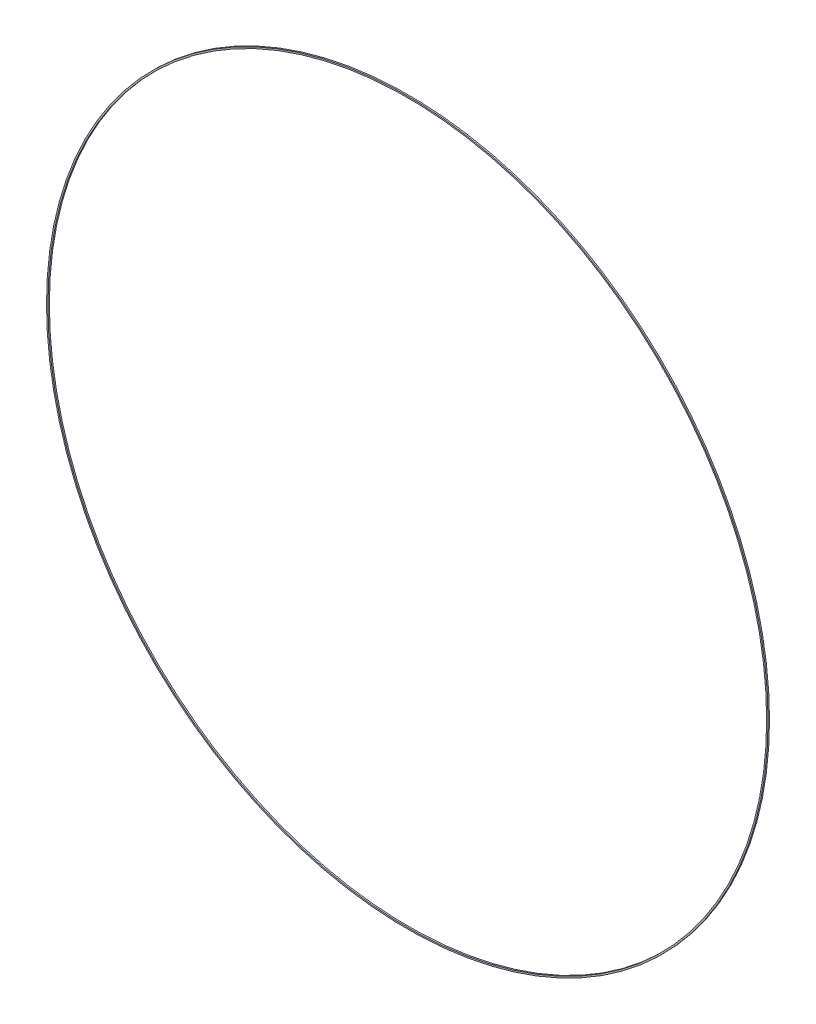
ISO-10303-21;
HEADER;
FILE_DESCRIPTION(('STEP AP214'),'2;1');
FILE_NAME('part.step','',(''),(''),'','','');
FILE_SCHEMA(('AUTOMOTIVE_DESIGN { 1 0 10303 214 1 1 1 1 }'));
ENDSEC;
DATA;
#1=APPLICATION_CONTEXT('core data for automotive mechanical design processes');
#2=APPLICATION_PROTOCOL_DEFINITION('international standard','automotive_design',2000,#1);
#3=PRODUCT_CONTEXT('',#1,'mechanical');
#4=PRODUCT('Part','Part','',(#3));
#5=PRODUCT_RELATED_PRODUCT_CATEGORY('part','',(#4));
#6=PRODUCT_DEFINITION_FORMATION('','',#4);
#7=PRODUCT_DEFINITION_CONTEXT('part definition',#1,'design');
#8=PRODUCT_DEFINITION('design','',#6,#7);
#9=PRODUCT_DEFINITION_SHAPE('','',#8);
#10=(LENGTH_UNIT() NAMED_UNIT(*) SI_UNIT(.MILLI.,.METRE.));
#11=(NAMED_UNIT(*) PLANE_ANGLE_UNIT() SI_UNIT($,.RADIAN.));
#12=(NAMED_UNIT(*) SI_UNIT($,.STERADIAN.) SOLID_ANGLE_UNIT());
#13=UNCERTAINTY_MEASURE_WITH_UNIT(LENGTH_MEASURE(1.E-05),#10,'distance_accuracy_value','');
#14=(GEOMETRIC_REPRESENTATION_CONTEXT(3) GLOBAL_UNCERTAINTY_ASSIGNED_CONTEXT((#13)) GLOBAL_UNIT_ASSIGNED_CONTEXT((#10,
#11,#12)) REPRESENTATION_CONTEXT('',''));
#15=CARTESIAN_POINT('',(0.,0.,0.));
#16=DIRECTION('',(0.,0.,1.));
#17=DIRECTION('',(1.,0.,0.));
#18=AXIS2_PLACEMENT_3D('',#15,#16,#17);
#19=CARTESIAN_POINT('',(0.,-500.5,2.));
#20=DIRECTION('',(0.,0.,1.));
#21=DIRECTION('',(1.,0.,0.));
#22=AXIS2_PLACEMENT_3D('',#19,#20,#21);
#23=PLANE('',#22);
#24=CARTESIAN_POINT('',(0.,-500.5,2.));
#25=DIRECTION('',(0.,0.,1.));
#26=DIRECTION('',(1.,0.,0.));
#27=AXIS2_PLACEMENT_3D('',#24,#25,#26);
#28=CIRCLE('',#27,500.5);
#29=CARTESIAN_POINT('',(500.5,-500.5,2.));
#30=VERTEX_POINT('',#29);
#31=EDGE_CURVE('E10',#30,#30,#28,.T.);
#32=ORIENTED_EDGE('',*,*,#31,.T.);
#33=EDGE_LOOP('',(#32));
#34=FACE_BOUND('',#33,.T.);
#35=CARTESIAN_POINT('',(0.,-500.5,2.));
#36=DIRECTION('',(0.,0.,1.));
#37=DIRECTION('',(1.,0.,0.));
#38=AXIS2_PLACEMENT_3D('',#35,#36,#37);
#39=CIRCLE('',#38,498.5);
#40=CARTESIAN_POINT('',(498.5,-500.5,2.));
#41=VERTEX_POINT('',#40);
#42=EDGE_CURVE('E42',#41,#41,#39,.T.);
#43=ORIENTED_EDGE('',*,*,#42,.F.);
#44=EDGE_LOOP('',(#43));
#45=FACE_BOUND('',#44,.T.);
#46=ADVANCED_FACE('F31',(#34,#45),#23,.T.);
#47=CARTESIAN_POINT('',(0.,-500.5,0.));
#48=DIRECTION('',(0.,0.,1.));
#49=DIRECTION('',(1.,0.,0.));
#50=AXIS2_PLACEMENT_3D('',#47,#48,#49);
#51=PLANE('',#50);
#52=CARTESIAN_POINT('',(0.,-500.5,0.));
#53=DIRECTION('',(0.,0.,1.));
#54=DIRECTION('',(1.,0.,0.));
#55=AXIS2_PLACEMENT_3D('',#52,#53,#54);
#56=CIRCLE('',#55,500.5);
#57=CARTESIAN_POINT('',(500.5,-500.5,0.));
#58=VERTEX_POINT('',#57);
#59=EDGE_CURVE('E35',#58,#58,#56,.T.);
#60=ORIENTED_EDGE('',*,*,#59,.F.);
#61=EDGE_LOOP('',(#60));
#62=FACE_BOUND('',#61,.T.);
#63=CARTESIAN_POINT('',(0.,-500.5,0.));
#64=DIRECTION('',(0.,0.,1.));
#65=DIRECTION('',(1.,0.,0.));
#66=AXIS2_PLACEMENT_3D('',#63,#64,#65);
#67=CIRCLE('',#66,498.5);
#68=CARTESIAN_POINT('',(498.5,-500.5,0.));
#69=VERTEX_POINT('',#68);
#70=EDGE_CURVE('E44',#69,#69,#67,.T.);
#71=ORIENTED_EDGE('',*,*,#70,.T.);
#72=EDGE_LOOP('',(#71));
#73=FACE_BOUND('',#72,.T.);
#74=ADVANCED_FACE('F54',(#62,#73),#51,.F.);
#75=CARTESIAN_POINT('',(0.,-500.5,2.));
#76=DIRECTION('',(0.,0.,-1.));
#77=DIRECTION('',(-1.,0.,0.));
#78=AXIS2_PLACEMENT_3D('',#75,#76,#77);
#79=CYLINDRICAL_SURFACE('',#78,500.5);
#80=ORIENTED_EDGE('',*,*,#31,.F.);
#81=EDGE_LOOP('',(#80));
#82=FACE_BOUND('',#81,.T.);
#83=ORIENTED_EDGE('',*,*,#59,.T.);
#84=EDGE_LOOP('',(#83));
#85=FACE_BOUND('',#84,.T.);
#86=ADVANCED_FACE('F33',(#82,#85),#79,.T.);
#87=CARTESIAN_POINT('',(0.,-500.5,2.));
#88=DIRECTION('',(0.,0.,-1.));
#89=DIRECTION('',(-1.,0.,0.));
#90=AXIS2_PLACEMENT_3D('',#87,#88,#89);
#91=CYLINDRICAL_SURFACE('',#90,498.5);
#92=ORIENTED_EDGE('',*,*,#42,.T.);
#93=EDGE_LOOP('',(#92));
#94=FACE_BOUND('',#93,.T.);
#95=ORIENTED_EDGE('',*,*,#70,.F.);
#96=EDGE_LOOP('',(#95));
#97=FACE_BOUND('',#96,.T.);
#98=ADVANCED_FACE('F50',(#94,#97),#91,.F.);
#99=CLOSED_SHELL('',(#46,#74,#86,#98));
#100=MANIFOLD_SOLID_BREP('B2',#99);
#101=ADVANCED_BREP_SHAPE_REPRESENTATION('',(#18,#100),#14);
#102=SHAPE_DEFINITION_REPRESENTATION(#9,#101);
ENDSEC;
END-ISO-10303-21;
